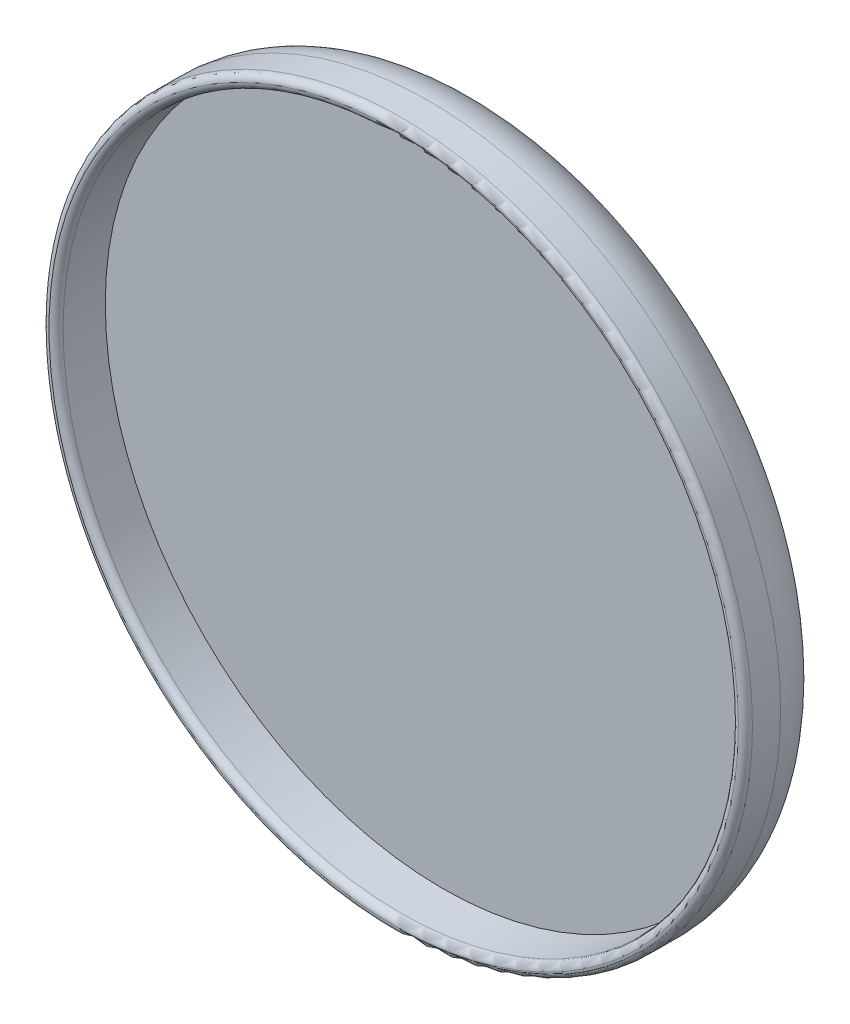
ISO-10303-21;
HEADER;
FILE_DESCRIPTION(('STEP AP214'),'2;1');
FILE_NAME('part.step','',(''),(''),'','','');
FILE_SCHEMA(('AUTOMOTIVE_DESIGN { 1 0 10303 214 1 1 1 1 }'));
ENDSEC;
DATA;
#1=APPLICATION_CONTEXT('core data for automotive mechanical design processes');
#2=APPLICATION_PROTOCOL_DEFINITION('international standard','automotive_design',2000,#1);
#3=PRODUCT_CONTEXT('',#1,'mechanical');
#4=PRODUCT('Part','Part','',(#3));
#5=PRODUCT_RELATED_PRODUCT_CATEGORY('part','',(#4));
#6=PRODUCT_DEFINITION_FORMATION('','',#4);
#7=PRODUCT_DEFINITION_CONTEXT('part definition',#1,'design');
#8=PRODUCT_DEFINITION('design','',#6,#7);
#9=PRODUCT_DEFINITION_SHAPE('','',#8);
#10=(LENGTH_UNIT() NAMED_UNIT(*) SI_UNIT(.MILLI.,.METRE.));
#11=(NAMED_UNIT(*) PLANE_ANGLE_UNIT() SI_UNIT($,.RADIAN.));
#12=(NAMED_UNIT(*) SI_UNIT($,.STERADIAN.) SOLID_ANGLE_UNIT());
#13=UNCERTAINTY_MEASURE_WITH_UNIT(LENGTH_MEASURE(1.E-05),#10,'distance_accuracy_value','');
#14=(GEOMETRIC_REPRESENTATION_CONTEXT(3) GLOBAL_UNCERTAINTY_ASSIGNED_CONTEXT((#13)) GLOBAL_UNIT_ASSIGNED_CONTEXT((#10,
#11,#12)) REPRESENTATION_CONTEXT('',''));
#15=CARTESIAN_POINT('',(0.,0.,0.));
#16=DIRECTION('',(0.,0.,1.));
#17=DIRECTION('',(1.,0.,0.));
#18=AXIS2_PLACEMENT_3D('',#15,#16,#17);
#19=CARTESIAN_POINT('',(0.,0.,-3.5));
#20=DIRECTION('',(0.,0.,1.));
#21=DIRECTION('',(1.,0.,0.));
#22=AXIS2_PLACEMENT_3D('',#19,#20,#21);
#23=CYLINDRICAL_SURFACE('',#22,1.95);
#24=CARTESIAN_POINT('',(0.,0.,-2.5));
#25=DIRECTION('',(0.,0.,1.));
#26=DIRECTION('',(1.,0.,0.));
#27=AXIS2_PLACEMENT_3D('',#24,#25,#26);
#28=CIRCLE('',#27,1.95);
#29=CARTESIAN_POINT('',(1.95,0.,-2.5));
#30=VERTEX_POINT('',#29);
#31=EDGE_CURVE('E53',#30,#30,#28,.T.);
#32=ORIENTED_EDGE('',*,*,#31,.T.);
#33=EDGE_LOOP('',(#32));
#34=FACE_BOUND('',#33,.T.);
#35=CARTESIAN_POINT('',(0.,0.,0.749999999999998));
#36=DIRECTION('',(0.,0.,1.));
#37=DIRECTION('',(1.,0.,0.));
#38=AXIS2_PLACEMENT_3D('',#35,#36,#37);
#39=CIRCLE('',#38,1.95);
#40=CARTESIAN_POINT('',(1.95,0.,0.749999999999998));
#41=VERTEX_POINT('',#40);
#42=EDGE_CURVE('E58',#41,#41,#39,.F.);
#43=ORIENTED_EDGE('',*,*,#42,.T.);
#44=EDGE_LOOP('',(#43));
#45=FACE_BOUND('',#44,.T.);
#46=ADVANCED_FACE('F45',(#34,#45),#23,.T.);
#47=CARTESIAN_POINT('',(0.,0.,-3.5));
#48=DIRECTION('',(0.,0.,1.));
#49=DIRECTION('',(1.,0.,0.));
#50=AXIS2_PLACEMENT_3D('',#47,#48,#49);
#51=PLANE('',#50);
#52=CARTESIAN_POINT('',(0.,0.,-3.5));
#53=DIRECTION('',(0.,0.,1.));
#54=DIRECTION('',(1.,0.,0.));
#55=AXIS2_PLACEMENT_3D('',#52,#53,#54);
#56=CIRCLE('',#55,0.950000000000001);
#57=CARTESIAN_POINT('',(0.950000000000001,0.,-3.5));
#58=VERTEX_POINT('',#57);
#59=EDGE_CURVE('E10',#58,#58,#56,.F.);
#60=ORIENTED_EDGE('',*,*,#59,.T.);
#61=EDGE_LOOP('',(#60));
#62=FACE_BOUND('',#61,.T.);
#63=ADVANCED_FACE('F112',(#62),#51,.F.);
#64=CARTESIAN_POINT('',(0.,14.7500673336012,6.75));
#65=DIRECTION('',(0.,0.,-1.));
#66=DIRECTION('',(-1.,0.,0.));
#67=AXIS2_PLACEMENT_3D('',#64,#65,#66);
#68=CYLINDRICAL_SURFACE('',#67,25.);
#69=CARTESIAN_POINT('',(0.,14.7500673336012,7.75));
#70=DIRECTION('',(0.,0.,1.));
#71=DIRECTION('',(1.,0.,0.));
#72=AXIS2_PLACEMENT_3D('',#69,#70,#71);
#73=CIRCLE('',#72,25.);
#74=CARTESIAN_POINT('',(25.,14.7500673336012,7.75));
#75=VERTEX_POINT('',#74);
#76=EDGE_CURVE('E73',#75,#75,#73,.T.);
#77=ORIENTED_EDGE('',*,*,#76,.T.);
#78=EDGE_LOOP('',(#77));
#79=FACE_BOUND('',#78,.T.);
#80=CARTESIAN_POINT('',(0.,14.7500673336012,9.75));
#81=DIRECTION('',(0.,0.,1.));
#82=DIRECTION('',(1.,0.,0.));
#83=AXIS2_PLACEMENT_3D('',#80,#81,#82);
#84=CIRCLE('',#83,25.);
#85=CARTESIAN_POINT('',(25.,14.7500673336012,9.75));
#86=VERTEX_POINT('',#85);
#87=EDGE_CURVE('E86',#86,#86,#84,.F.);
#88=ORIENTED_EDGE('',*,*,#87,.T.);
#89=EDGE_LOOP('',(#88));
#90=FACE_BOUND('',#89,.T.);
#91=ADVANCED_FACE('F118',(#79,#90),#68,.T.);
#92=CARTESIAN_POINT('',(0.,14.7500673336012,3.75));
#93=DIRECTION('',(0.,0.,1.));
#94=DIRECTION('',(1.,0.,0.));
#95=AXIS2_PLACEMENT_3D('',#92,#93,#94);
#96=PLANE('',#95);
#97=CARTESIAN_POINT('',(0.,0.,3.75));
#98=DIRECTION('',(0.,0.,1.));
#99=DIRECTION('',(1.,0.,0.));
#100=AXIS2_PLACEMENT_3D('',#97,#98,#99);
#101=CIRCLE('',#100,5.28183754448762);
#102=CARTESIAN_POINT('',(5.28183754448762,0.,3.75));
#103=VERTEX_POINT('',#102);
#104=EDGE_CURVE('E63',#103,#103,#101,.T.);
#105=ORIENTED_EDGE('',*,*,#104,.T.);
#106=EDGE_LOOP('',(#105));
#107=FACE_BOUND('',#106,.T.);
#108=CARTESIAN_POINT('',(0.,14.7500673336012,3.75));
#109=DIRECTION('',(0.,0.,1.));
#110=DIRECTION('',(1.,0.,0.));
#111=AXIS2_PLACEMENT_3D('',#108,#109,#110);
#112=CIRCLE('',#111,21.);
#113=CARTESIAN_POINT('',(21.,14.7500673336012,3.75));
#114=VERTEX_POINT('',#113);
#115=EDGE_CURVE('E69',#114,#114,#112,.F.);
#116=ORIENTED_EDGE('',*,*,#115,.T.);
#117=EDGE_LOOP('',(#116));
#118=FACE_BOUND('',#117,.T.);
#119=ADVANCED_FACE('F107',(#107,#118),#96,.F.);
#120=CARTESIAN_POINT('',(0.,14.7500673336012,10.25));
#121=DIRECTION('',(0.,0.,-1.));
#122=DIRECTION('',(-1.,0.,0.));
#123=AXIS2_PLACEMENT_3D('',#120,#121,#122);
#124=CYLINDRICAL_SURFACE('',#123,24.);
#125=CARTESIAN_POINT('',(0.,14.7500673336012,9.75));
#126=DIRECTION('',(0.,0.,1.));
#127=DIRECTION('',(1.,0.,0.));
#128=AXIS2_PLACEMENT_3D('',#125,#126,#127);
#129=CIRCLE('',#128,24.);
#130=CARTESIAN_POINT('',(24.,14.7500673336012,9.75));
#131=VERTEX_POINT('',#130);
#132=EDGE_CURVE('E77',#131,#131,#129,.T.);
#133=ORIENTED_EDGE('',*,*,#132,.T.);
#134=EDGE_LOOP('',(#133));
#135=FACE_BOUND('',#134,.T.);
#136=CARTESIAN_POINT('',(0.,14.7500673336012,6.75));
#137=DIRECTION('',(0.,0.,1.));
#138=DIRECTION('',(1.,0.,0.));
#139=AXIS2_PLACEMENT_3D('',#136,#137,#138);
#140=CIRCLE('',#139,24.);
#141=CARTESIAN_POINT('',(24.,14.7500673336012,6.75));
#142=VERTEX_POINT('',#141);
#143=EDGE_CURVE('E82',#142,#142,#140,.F.);
#144=ORIENTED_EDGE('',*,*,#143,.T.);
#145=EDGE_LOOP('',(#144));
#146=FACE_BOUND('',#145,.T.);
#147=ADVANCED_FACE('F94',(#135,#146),#124,.F.);
#148=CARTESIAN_POINT('',(0.,14.7500673336012,6.75));
#149=DIRECTION('',(0.,0.,1.));
#150=DIRECTION('',(1.,0.,0.));
#151=AXIS2_PLACEMENT_3D('',#148,#149,#150);
#152=PLANE('',#151);
#153=ORIENTED_EDGE('',*,*,#143,.F.);
#154=EDGE_LOOP('',(#153));
#155=FACE_BOUND('',#154,.T.);
#156=ADVANCED_FACE('F96',(#155),#152,.T.);
#157=CARTESIAN_POINT('',(0.,14.7500673336012,9.75));
#158=DIRECTION('',(0.,0.,1.));
#159=DIRECTION('',(1.,0.,0.));
#160=AXIS2_PLACEMENT_3D('',#157,#158,#159);
#161=TOROIDAL_SURFACE('',#160,24.5,0.5);
#162=ORIENTED_EDGE('',*,*,#132,.F.);
#163=EDGE_LOOP('',(#162));
#164=FACE_BOUND('',#163,.T.);
#165=CARTESIAN_POINT('',(0.,14.7500673336012,10.25));
#166=DIRECTION('',(0.,0.,1.));
#167=DIRECTION('',(1.,0.,0.));
#168=AXIS2_PLACEMENT_3D('',#165,#166,#167);
#169=CIRCLE('',#168,24.5);
#170=CARTESIAN_POINT('',(24.5,14.7500673336012,10.25));
#171=VERTEX_POINT('',#170);
#172=EDGE_CURVE('E78',#171,#171,#169,.F.);
#173=ORIENTED_EDGE('',*,*,#172,.F.);
#174=EDGE_LOOP('',(#173));
#175=FACE_BOUND('',#174,.T.);
#176=ADVANCED_FACE('F98',(#164,#175),#161,.T.);
#177=CARTESIAN_POINT('',(0.,14.7500673336012,9.75));
#178=DIRECTION('',(0.,0.,1.));
#179=DIRECTION('',(1.,0.,0.));
#180=AXIS2_PLACEMENT_3D('',#177,#178,#179);
#181=TOROIDAL_SURFACE('',#180,24.5,0.5);
#182=ORIENTED_EDGE('',*,*,#87,.F.);
#183=EDGE_LOOP('',(#182));
#184=FACE_BOUND('',#183,.T.);
#185=ORIENTED_EDGE('',*,*,#172,.T.);
#186=EDGE_LOOP('',(#185));
#187=FACE_BOUND('',#186,.T.);
#188=ADVANCED_FACE('F104',(#184,#187),#181,.T.);
#189=CARTESIAN_POINT('',(0.,14.7500673336012,7.75));
#190=DIRECTION('',(0.,0.,1.));
#191=DIRECTION('',(1.,0.,0.));
#192=AXIS2_PLACEMENT_3D('',#189,#190,#191);
#193=TOROIDAL_SURFACE('',#192,21.,4.);
#194=ORIENTED_EDGE('',*,*,#115,.F.);
#195=EDGE_LOOP('',(#194));
#196=FACE_BOUND('',#195,.T.);
#197=ORIENTED_EDGE('',*,*,#76,.F.);
#198=EDGE_LOOP('',(#197));
#199=FACE_BOUND('',#198,.T.);
#200=ADVANCED_FACE('F124',(#196,#199),#193,.T.);
#201=CARTESIAN_POINT('',(0.,0.,3.75));
#202=DIRECTION('',(0.,0.,1.));
#203=DIRECTION('',(1.,0.,0.));
#204=AXIS2_PLACEMENT_3D('',#201,#202,#203);
#205=CONICAL_SURFACE('',#204,5.28183754448762,0.837758040957284);
#206=ORIENTED_EDGE('',*,*,#42,.F.);
#207=EDGE_LOOP('',(#206));
#208=FACE_BOUND('',#207,.T.);
#209=ORIENTED_EDGE('',*,*,#104,.F.);
#210=EDGE_LOOP('',(#209));
#211=FACE_BOUND('',#210,.T.);
#212=ADVANCED_FACE('F128',(#208,#211),#205,.T.);
#213=CARTESIAN_POINT('',(0.,0.,-2.5));
#214=DIRECTION('',(0.,0.,1.));
#215=DIRECTION('',(1.,0.,0.));
#216=AXIS2_PLACEMENT_3D('',#213,#214,#215);
#217=DEGENERATE_TOROIDAL_SURFACE('',#216,0.950000000000001,1.,.T.);
#218=ORIENTED_EDGE('',*,*,#59,.F.);
#219=EDGE_LOOP('',(#218));
#220=FACE_BOUND('',#219,.T.);
#221=ORIENTED_EDGE('',*,*,#31,.F.);
#222=EDGE_LOOP('',(#221));
#223=FACE_BOUND('',#222,.T.);
#224=ADVANCED_FACE('F47',(#220,#223),#217,.T.);
#225=CLOSED_SHELL('',(#46,#63,#91,#119,#147,#156,#176,#188,#200,#212,#224));
#226=MANIFOLD_SOLID_BREP('B2',#225);
#227=ADVANCED_BREP_SHAPE_REPRESENTATION('',(#18,#226),#14);
#228=SHAPE_DEFINITION_REPRESENTATION(#9,#227);
ENDSEC;
END-ISO-10303-21;
